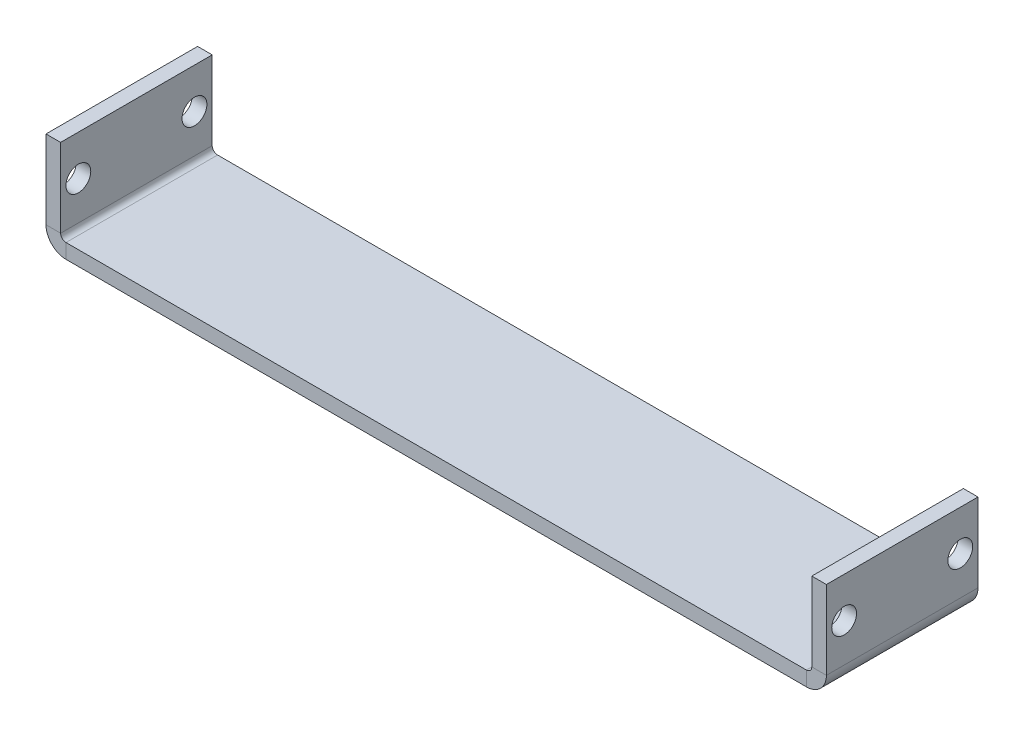
ISO-10303-21;
HEADER;
FILE_DESCRIPTION(('STEP AP214'),'2;1');
FILE_NAME('part.step','',(''),(''),'','','');
FILE_SCHEMA(('AUTOMOTIVE_DESIGN { 1 0 10303 214 1 1 1 1 }'));
ENDSEC;
DATA;
#1=APPLICATION_CONTEXT('core data for automotive mechanical design processes');
#2=APPLICATION_PROTOCOL_DEFINITION('international standard','automotive_design',2000,#1);
#3=PRODUCT_CONTEXT('',#1,'mechanical');
#4=PRODUCT('Part','Part','',(#3));
#5=PRODUCT_RELATED_PRODUCT_CATEGORY('part','',(#4));
#6=PRODUCT_DEFINITION_FORMATION('','',#4);
#7=PRODUCT_DEFINITION_CONTEXT('part definition',#1,'design');
#8=PRODUCT_DEFINITION('design','',#6,#7);
#9=PRODUCT_DEFINITION_SHAPE('','',#8);
#10=(LENGTH_UNIT() NAMED_UNIT(*) SI_UNIT(.MILLI.,.METRE.));
#11=(NAMED_UNIT(*) PLANE_ANGLE_UNIT() SI_UNIT($,.RADIAN.));
#12=(NAMED_UNIT(*) SI_UNIT($,.STERADIAN.) SOLID_ANGLE_UNIT());
#13=UNCERTAINTY_MEASURE_WITH_UNIT(LENGTH_MEASURE(1.E-05),#10,'distance_accuracy_value','');
#14=(GEOMETRIC_REPRESENTATION_CONTEXT(3) GLOBAL_UNCERTAINTY_ASSIGNED_CONTEXT((#13)) GLOBAL_UNIT_ASSIGNED_CONTEXT((#10,
#11,#12)) REPRESENTATION_CONTEXT('',''));
#15=CARTESIAN_POINT('',(0.,0.,0.));
#16=DIRECTION('',(0.,0.,1.));
#17=DIRECTION('',(1.,0.,0.));
#18=AXIS2_PLACEMENT_3D('',#15,#16,#17);
#19=CARTESIAN_POINT('',(0.,-2.,0.));
#20=DIRECTION('',(0.,-1.,0.));
#21=DIRECTION('',(0.,0.,-1.));
#22=AXIS2_PLACEMENT_3D('',#19,#20,#21);
#23=PLANE('',#22);
#24=DIRECTION('',(-1.,0.,0.));
#25=VECTOR('',#24,1.);
#26=CARTESIAN_POINT('',(8.41008153794016,-2.,-15.1442166992398));
#27=LINE('',#26,#25);
#28=CARTESIAN_POINT('',(-5.08991846205982,-2.,-15.1442166992398));
#29=VERTEX_POINT('',#28);
#30=CARTESIAN_POINT('',(-106.48064091206,-2.,-15.1442166992398));
#31=VERTEX_POINT('',#30);
#32=EDGE_CURVE('E57',#29,#31,#27,.T.);
#33=ORIENTED_EDGE('',*,*,#32,.F.);
#34=DIRECTION('',(0.,0.,1.));
#35=VECTOR('',#34,1.);
#36=CARTESIAN_POINT('',(-5.08991846205982,-2.,0.));
#37=LINE('',#36,#35);
#38=CARTESIAN_POINT('',(-5.08991846205983,-2.,5.61456868899448));
#39=VERTEX_POINT('',#38);
#40=EDGE_CURVE('E264',#29,#39,#37,.T.);
#41=ORIENTED_EDGE('',*,*,#40,.T.);
#42=DIRECTION('',(1.,0.,0.));
#43=VECTOR('',#42,1.);
#44=CARTESIAN_POINT('',(8.41008153794016,-2.,5.61456868899448));
#45=LINE('',#44,#43);
#46=CARTESIAN_POINT('',(-106.48064091206,-2.,5.6145686889945));
#47=VERTEX_POINT('',#46);
#48=EDGE_CURVE('E271',#47,#39,#45,.T.);
#49=ORIENTED_EDGE('',*,*,#48,.F.);
#50=DIRECTION('',(0.,0.,1.));
#51=VECTOR('',#50,1.);
#52=CARTESIAN_POINT('',(-106.48064091206,-2.,0.));
#53=LINE('',#52,#51);
#54=EDGE_CURVE('E253',#31,#47,#53,.T.);
#55=ORIENTED_EDGE('',*,*,#54,.F.);
#56=EDGE_LOOP('',(#33,#41,#49,#55));
#57=FACE_BOUND('',#56,.T.);
#58=ADVANCED_FACE('F53',(#57),#23,.T.);
#59=CARTESIAN_POINT('',(8.41008153794016,-2.,5.61456868899448));
#60=DIRECTION('',(0.,0.,1.));
#61=DIRECTION('',(1.,0.,0.));
#62=AXIS2_PLACEMENT_3D('',#59,#60,#61);
#63=PLANE('',#62);
#64=ORIENTED_EDGE('',*,*,#48,.T.);
#65=DIRECTION('',(0.,1.,0.));
#66=VECTOR('',#65,1.);
#67=CARTESIAN_POINT('',(-5.08991846205982,-2.,5.61456868899448));
#68=LINE('',#67,#66);
#69=CARTESIAN_POINT('',(-5.08991846205982,0.,5.61456868899448));
#70=VERTEX_POINT('',#69);
#71=EDGE_CURVE('E12',#39,#70,#68,.T.);
#72=ORIENTED_EDGE('',*,*,#71,.T.);
#73=DIRECTION('',(1.,0.,0.));
#74=VECTOR('',#73,1.);
#75=CARTESIAN_POINT('',(8.41008153794016,0.,5.61456868899448));
#76=LINE('',#75,#74);
#77=CARTESIAN_POINT('',(-106.48064091206,0.,5.6145686889945));
#78=VERTEX_POINT('',#77);
#79=EDGE_CURVE('E248',#78,#70,#76,.T.);
#80=ORIENTED_EDGE('',*,*,#79,.F.);
#81=DIRECTION('',(0.,1.,0.));
#82=VECTOR('',#81,1.);
#83=CARTESIAN_POINT('',(-106.48064091206,-2.,5.6145686889945));
#84=LINE('',#83,#82);
#85=EDGE_CURVE('E256',#47,#78,#84,.T.);
#86=ORIENTED_EDGE('',*,*,#85,.F.);
#87=EDGE_LOOP('',(#64,#72,#80,#86));
#88=FACE_BOUND('',#87,.T.);
#89=ADVANCED_FACE('F55',(#88),#63,.T.);
#90=CARTESIAN_POINT('',(8.41008153794016,-2.,-15.1442166992398));
#91=DIRECTION('',(0.,0.,-1.));
#92=DIRECTION('',(-1.,0.,0.));
#93=AXIS2_PLACEMENT_3D('',#90,#91,#92);
#94=PLANE('',#93);
#95=DIRECTION('',(-1.,0.,0.));
#96=VECTOR('',#95,1.);
#97=CARTESIAN_POINT('',(8.41008153794016,0.,-15.1442166992398));
#98=LINE('',#97,#96);
#99=CARTESIAN_POINT('',(-5.08991846205983,0.,-15.1442166992398));
#100=VERTEX_POINT('',#99);
#101=CARTESIAN_POINT('',(-106.48064091206,0.,-15.1442166992398));
#102=VERTEX_POINT('',#101);
#103=EDGE_CURVE('E76',#100,#102,#98,.T.);
#104=ORIENTED_EDGE('',*,*,#103,.F.);
#105=DIRECTION('',(0.,-1.,0.));
#106=VECTOR('',#105,1.);
#107=CARTESIAN_POINT('',(-5.08991846205983,-2.,-15.1442166992398));
#108=LINE('',#107,#106);
#109=EDGE_CURVE('E267',#100,#29,#108,.T.);
#110=ORIENTED_EDGE('',*,*,#109,.T.);
#111=ORIENTED_EDGE('',*,*,#32,.T.);
#112=DIRECTION('',(0.,-1.,0.));
#113=VECTOR('',#112,1.);
#114=CARTESIAN_POINT('',(-106.48064091206,-2.,-15.1442166992398));
#115=LINE('',#114,#113);
#116=EDGE_CURVE('E261',#102,#31,#115,.T.);
#117=ORIENTED_EDGE('',*,*,#116,.F.);
#118=EDGE_LOOP('',(#104,#110,#111,#117));
#119=FACE_BOUND('',#118,.T.);
#120=ADVANCED_FACE('F289',(#119),#94,.T.);
#121=CARTESIAN_POINT('',(0.,0.,0.));
#122=DIRECTION('',(0.,-1.,0.));
#123=DIRECTION('',(0.,0.,-1.));
#124=AXIS2_PLACEMENT_3D('',#121,#122,#123);
#125=PLANE('',#124);
#126=DIRECTION('',(0.,0.,1.));
#127=VECTOR('',#126,1.);
#128=CARTESIAN_POINT('',(-5.08991846205982,0.,0.));
#129=LINE('',#128,#127);
#130=EDGE_CURVE('E62',#100,#70,#129,.T.);
#131=ORIENTED_EDGE('',*,*,#130,.F.);
#132=ORIENTED_EDGE('',*,*,#103,.T.);
#133=DIRECTION('',(0.,0.,1.));
#134=VECTOR('',#133,1.);
#135=CARTESIAN_POINT('',(-106.48064091206,0.,0.));
#136=LINE('',#135,#134);
#137=EDGE_CURVE('E259',#102,#78,#136,.T.);
#138=ORIENTED_EDGE('',*,*,#137,.T.);
#139=ORIENTED_EDGE('',*,*,#79,.T.);
#140=EDGE_LOOP('',(#131,#132,#138,#139));
#141=FACE_BOUND('',#140,.T.);
#142=ADVANCED_FACE('F275',(#141),#125,.F.);
#143=CARTESIAN_POINT('',(-106.48064091206,0.7366,-15.1442166992398));
#144=DIRECTION('',(0.,0.,-1.));
#145=DIRECTION('',(-1.,0.,0.));
#146=AXIS2_PLACEMENT_3D('',#143,#144,#145);
#147=PLANE('',#146);
#148=DIRECTION('',(-1.,0.,0.));
#149=VECTOR('',#148,1.);
#150=CARTESIAN_POINT('',(-109.21724091206,0.736600000000004,-15.1442166992398));
#151=LINE('',#150,#149);
#152=CARTESIAN_POINT('',(-107.21724091206,0.73659999999999,-15.1442166992398));
#153=VERTEX_POINT('',#152);
#154=CARTESIAN_POINT('',(-109.21724091206,0.736600000000013,-15.1442166992398));
#155=VERTEX_POINT('',#154);
#156=EDGE_CURVE('E205',#153,#155,#151,.T.);
#157=ORIENTED_EDGE('',*,*,#156,.F.);
#158=CARTESIAN_POINT('',(-106.48064091206,0.7366,-15.1442166992398));
#159=DIRECTION('',(0.,0.,-1.));
#160=DIRECTION('',(-1.,0.,0.));
#161=AXIS2_PLACEMENT_3D('',#158,#159,#160);
#162=CIRCLE('',#161,0.7366);
#163=EDGE_CURVE('E202',#153,#102,#162,.F.);
#164=ORIENTED_EDGE('',*,*,#163,.T.);
#165=ORIENTED_EDGE('',*,*,#116,.T.);
#166=CARTESIAN_POINT('',(-106.48064091206,0.7366,-15.1442166992398));
#167=DIRECTION('',(0.,0.,1.));
#168=DIRECTION('',(-1.,0.,0.));
#169=AXIS2_PLACEMENT_3D('',#166,#167,#168);
#170=CIRCLE('',#169,2.7366);
#171=EDGE_CURVE('E241',#155,#31,#170,.T.);
#172=ORIENTED_EDGE('',*,*,#171,.F.);
#173=EDGE_LOOP('',(#157,#164,#165,#172));
#174=FACE_BOUND('',#173,.T.);
#175=ADVANCED_FACE('F343',(#174),#147,.T.);
#176=CARTESIAN_POINT('',(-106.48064091206,0.7366,5.6145686889945));
#177=DIRECTION('',(0.,0.,1.));
#178=DIRECTION('',(1.,0.,0.));
#179=AXIS2_PLACEMENT_3D('',#176,#177,#178);
#180=PLANE('',#179);
#181=CARTESIAN_POINT('',(-106.48064091206,0.7366,5.6145686889945));
#182=DIRECTION('',(0.,0.,-1.));
#183=DIRECTION('',(-1.,0.,0.));
#184=AXIS2_PLACEMENT_3D('',#181,#182,#183);
#185=CIRCLE('',#184,0.7366);
#186=CARTESIAN_POINT('',(-107.21724091206,0.73659999999999,5.6145686889945));
#187=VERTEX_POINT('',#186);
#188=EDGE_CURVE('E245',#78,#187,#185,.T.);
#189=ORIENTED_EDGE('',*,*,#188,.T.);
#190=DIRECTION('',(1.,0.,0.));
#191=VECTOR('',#190,1.);
#192=CARTESIAN_POINT('',(-109.21724091206,0.736600000000004,5.6145686889945));
#193=LINE('',#192,#191);
#194=CARTESIAN_POINT('',(-109.21724091206,0.736600000000004,5.6145686889945));
#195=VERTEX_POINT('',#194);
#196=EDGE_CURVE('E214',#195,#187,#193,.T.);
#197=ORIENTED_EDGE('',*,*,#196,.F.);
#198=CARTESIAN_POINT('',(-106.48064091206,0.7366,5.6145686889945));
#199=DIRECTION('',(0.,0.,-1.));
#200=DIRECTION('',(1.,0.,0.));
#201=AXIS2_PLACEMENT_3D('',#198,#199,#200);
#202=CIRCLE('',#201,2.7366);
#203=EDGE_CURVE('E244',#47,#195,#202,.T.);
#204=ORIENTED_EDGE('',*,*,#203,.F.);
#205=ORIENTED_EDGE('',*,*,#85,.T.);
#206=EDGE_LOOP('',(#189,#197,#204,#205));
#207=FACE_BOUND('',#206,.T.);
#208=ADVANCED_FACE('F339',(#207),#180,.T.);
#209=CARTESIAN_POINT('',(-106.48064091206,0.7366,16.2677295393068));
#210=DIRECTION('',(0.,0.,-1.));
#211=DIRECTION('',(-1.,0.,0.));
#212=AXIS2_PLACEMENT_3D('',#209,#210,#211);
#213=CYLINDRICAL_SURFACE('',#212,2.7366);
#214=ORIENTED_EDGE('',*,*,#54,.T.);
#215=ORIENTED_EDGE('',*,*,#203,.T.);
#216=DIRECTION('',(0.,0.,1.));
#217=VECTOR('',#216,1.);
#218=CARTESIAN_POINT('',(-109.21724091206,0.736600000000004,0.));
#219=LINE('',#218,#217);
#220=EDGE_CURVE('E220',#155,#195,#219,.T.);
#221=ORIENTED_EDGE('',*,*,#220,.F.);
#222=ORIENTED_EDGE('',*,*,#171,.T.);
#223=EDGE_LOOP('',(#214,#215,#221,#222));
#224=FACE_BOUND('',#223,.T.);
#225=ADVANCED_FACE('F351',(#224),#213,.T.);
#226=CARTESIAN_POINT('',(-106.48064091206,0.7366,16.2677295393068));
#227=DIRECTION('',(0.,0.,-1.));
#228=DIRECTION('',(-1.,0.,0.));
#229=AXIS2_PLACEMENT_3D('',#226,#227,#228);
#230=CYLINDRICAL_SURFACE('',#229,0.7366);
#231=ORIENTED_EDGE('',*,*,#137,.F.);
#232=ORIENTED_EDGE('',*,*,#163,.F.);
#233=DIRECTION('',(0.,0.,1.));
#234=VECTOR('',#233,1.);
#235=CARTESIAN_POINT('',(-107.21724091206,0.73659999999999,0.));
#236=LINE('',#235,#234);
#237=EDGE_CURVE('E195',#153,#187,#236,.T.);
#238=ORIENTED_EDGE('',*,*,#237,.T.);
#239=ORIENTED_EDGE('',*,*,#188,.F.);
#240=EDGE_LOOP('',(#231,#232,#238,#239));
#241=FACE_BOUND('',#240,.T.);
#242=ADVANCED_FACE('F355',(#241),#230,.F.);
#243=CARTESIAN_POINT('',(-109.21724091206,11.508755098888,-15.1442166992398));
#244=DIRECTION('',(0.,1.,0.));
#245=DIRECTION('',(0.,0.,1.));
#246=AXIS2_PLACEMENT_3D('',#243,#244,#245);
#247=PLANE('',#246);
#248=DIRECTION('',(0.,0.,1.));
#249=VECTOR('',#248,1.);
#250=CARTESIAN_POINT('',(-107.21724091206,11.508755098888,-15.1442166992398));
#251=LINE('',#250,#249);
#252=CARTESIAN_POINT('',(-107.21724091206,11.508755098888,-15.1442166992398));
#253=VERTEX_POINT('',#252);
#254=CARTESIAN_POINT('',(-107.21724091206,11.508755098888,5.6145686889945));
#255=VERTEX_POINT('',#254);
#256=EDGE_CURVE('E209',#253,#255,#251,.T.);
#257=ORIENTED_EDGE('',*,*,#256,.F.);
#258=DIRECTION('',(1.,0.,0.));
#259=VECTOR('',#258,1.);
#260=CARTESIAN_POINT('',(-109.21724091206,11.508755098888,-15.1442166992398));
#261=LINE('',#260,#259);
#262=CARTESIAN_POINT('',(-109.21724091206,11.508755098888,-15.1442166992398));
#263=VERTEX_POINT('',#262);
#264=EDGE_CURVE('E199',#263,#253,#261,.T.);
#265=ORIENTED_EDGE('',*,*,#264,.F.);
#266=DIRECTION('',(0.,0.,1.));
#267=VECTOR('',#266,1.);
#268=CARTESIAN_POINT('',(-109.21724091206,11.508755098888,-15.1442166992398));
#269=LINE('',#268,#267);
#270=CARTESIAN_POINT('',(-109.21724091206,11.508755098888,5.6145686889945));
#271=VERTEX_POINT('',#270);
#272=EDGE_CURVE('E236',#263,#271,#269,.T.);
#273=ORIENTED_EDGE('',*,*,#272,.T.);
#274=DIRECTION('',(1.,0.,0.));
#275=VECTOR('',#274,1.);
#276=CARTESIAN_POINT('',(-109.21724091206,11.508755098888,5.6145686889945));
#277=LINE('',#276,#275);
#278=EDGE_CURVE('E234',#271,#255,#277,.T.);
#279=ORIENTED_EDGE('',*,*,#278,.T.);
#280=EDGE_LOOP('',(#257,#265,#273,#279));
#281=FACE_BOUND('',#280,.T.);
#282=ADVANCED_FACE('F358',(#281),#247,.T.);
#283=CARTESIAN_POINT('',(-109.21724091206,6.00875509888797,-12.7148240051227));
#284=DIRECTION('',(1.,0.,0.));
#285=DIRECTION('',(0.,0.,1.));
#286=AXIS2_PLACEMENT_3D('',#283,#284,#285);
#287=CYLINDRICAL_SURFACE('',#286,1.7);
#288=CARTESIAN_POINT('',(-109.21724091206,6.00875509888797,-12.7148240051227));
#289=DIRECTION('',(1.,0.,0.));
#290=DIRECTION('',(0.,0.,-1.));
#291=AXIS2_PLACEMENT_3D('',#288,#289,#290);
#292=CIRCLE('',#291,1.7);
#293=CARTESIAN_POINT('',(-109.21724091206,6.00875509888797,-14.4148240051227));
#294=VERTEX_POINT('',#293);
#295=EDGE_CURVE('E222',#294,#294,#292,.T.);
#296=ORIENTED_EDGE('',*,*,#295,.F.);
#297=EDGE_LOOP('',(#296));
#298=FACE_BOUND('',#297,.T.);
#299=CARTESIAN_POINT('',(-107.21724091206,6.00875509888796,-12.7148240051227));
#300=DIRECTION('',(1.,0.,0.));
#301=DIRECTION('',(0.,0.,-1.));
#302=AXIS2_PLACEMENT_3D('',#299,#300,#301);
#303=CIRCLE('',#302,1.7);
#304=CARTESIAN_POINT('',(-107.21724091206,6.00875509888796,-14.4148240051227));
#305=VERTEX_POINT('',#304);
#306=EDGE_CURVE('E231',#305,#305,#303,.T.);
#307=ORIENTED_EDGE('',*,*,#306,.T.);
#308=EDGE_LOOP('',(#307));
#309=FACE_BOUND('',#308,.T.);
#310=ADVANCED_FACE('F382',(#298,#309),#287,.F.);
#311=CARTESIAN_POINT('',(-109.21724091206,6.00875509888797,3.18517599487734));
#312=DIRECTION('',(1.,0.,0.));
#313=DIRECTION('',(0.,0.,1.));
#314=AXIS2_PLACEMENT_3D('',#311,#312,#313);
#315=CYLINDRICAL_SURFACE('',#314,1.7);
#316=CARTESIAN_POINT('',(-109.21724091206,6.00875509888797,3.18517599487734));
#317=DIRECTION('',(1.,0.,0.));
#318=DIRECTION('',(0.,0.,-1.));
#319=AXIS2_PLACEMENT_3D('',#316,#317,#318);
#320=CIRCLE('',#319,1.7);
#321=CARTESIAN_POINT('',(-109.21724091206,6.00875509888797,1.48517599487734));
#322=VERTEX_POINT('',#321);
#323=EDGE_CURVE('E225',#322,#322,#320,.T.);
#324=ORIENTED_EDGE('',*,*,#323,.F.);
#325=EDGE_LOOP('',(#324));
#326=FACE_BOUND('',#325,.T.);
#327=CARTESIAN_POINT('',(-107.21724091206,6.00875509888796,3.18517599487734));
#328=DIRECTION('',(1.,0.,0.));
#329=DIRECTION('',(0.,0.,-1.));
#330=AXIS2_PLACEMENT_3D('',#327,#328,#329);
#331=CIRCLE('',#330,1.7);
#332=CARTESIAN_POINT('',(-107.21724091206,6.00875509888796,1.48517599487734));
#333=VERTEX_POINT('',#332);
#334=EDGE_CURVE('E228',#333,#333,#331,.T.);
#335=ORIENTED_EDGE('',*,*,#334,.T.);
#336=EDGE_LOOP('',(#335));
#337=FACE_BOUND('',#336,.T.);
#338=ADVANCED_FACE('F378',(#326,#337),#315,.F.);
#339=CARTESIAN_POINT('',(-109.21724091206,-108.471885813172,0.));
#340=DIRECTION('',(-1.,0.,0.));
#341=DIRECTION('',(0.,0.,-1.));
#342=AXIS2_PLACEMENT_3D('',#339,#340,#341);
#343=PLANE('',#342);
#344=ORIENTED_EDGE('',*,*,#323,.T.);
#345=EDGE_LOOP('',(#344));
#346=FACE_BOUND('',#345,.T.);
#347=ORIENTED_EDGE('',*,*,#295,.T.);
#348=EDGE_LOOP('',(#347));
#349=FACE_BOUND('',#348,.T.);
#350=DIRECTION('',(0.,1.,0.));
#351=VECTOR('',#350,1.);
#352=CARTESIAN_POINT('',(-109.21724091206,-116.881967351112,-15.1442166992398));
#353=LINE('',#352,#351);
#354=EDGE_CURVE('E203',#155,#263,#353,.T.);
#355=ORIENTED_EDGE('',*,*,#354,.F.);
#356=ORIENTED_EDGE('',*,*,#220,.T.);
#357=DIRECTION('',(0.,-1.,0.));
#358=VECTOR('',#357,1.);
#359=CARTESIAN_POINT('',(-109.21724091206,-116.881967351112,5.61456868899448));
#360=LINE('',#359,#358);
#361=EDGE_CURVE('E217',#271,#195,#360,.T.);
#362=ORIENTED_EDGE('',*,*,#361,.F.);
#363=ORIENTED_EDGE('',*,*,#272,.F.);
#364=EDGE_LOOP('',(#355,#356,#362,#363));
#365=FACE_BOUND('',#364,.T.);
#366=ADVANCED_FACE('F374',(#346,#349,#365),#343,.T.);
#367=CARTESIAN_POINT('',(-109.21724091206,-116.881967351112,5.61456868899448));
#368=DIRECTION('',(0.,0.,1.));
#369=DIRECTION('',(0.,-1.,0.));
#370=AXIS2_PLACEMENT_3D('',#367,#368,#369);
#371=PLANE('',#370);
#372=ORIENTED_EDGE('',*,*,#361,.T.);
#373=ORIENTED_EDGE('',*,*,#196,.T.);
#374=DIRECTION('',(0.,-1.,0.));
#375=VECTOR('',#374,1.);
#376=CARTESIAN_POINT('',(-107.21724091206,-116.881967351112,5.61456868899448));
#377=LINE('',#376,#375);
#378=EDGE_CURVE('E207',#255,#187,#377,.T.);
#379=ORIENTED_EDGE('',*,*,#378,.F.);
#380=ORIENTED_EDGE('',*,*,#278,.F.);
#381=EDGE_LOOP('',(#372,#373,#379,#380));
#382=FACE_BOUND('',#381,.T.);
#383=ADVANCED_FACE('F370',(#382),#371,.T.);
#384=CARTESIAN_POINT('',(-107.21724091206,-108.471885813172,0.));
#385=DIRECTION('',(-1.,0.,0.));
#386=DIRECTION('',(0.,0.,-1.));
#387=AXIS2_PLACEMENT_3D('',#384,#385,#386);
#388=PLANE('',#387);
#389=ORIENTED_EDGE('',*,*,#237,.F.);
#390=DIRECTION('',(0.,1.,0.));
#391=VECTOR('',#390,1.);
#392=CARTESIAN_POINT('',(-107.21724091206,-116.881967351112,-15.1442166992398));
#393=LINE('',#392,#391);
#394=EDGE_CURVE('E212',#153,#253,#393,.T.);
#395=ORIENTED_EDGE('',*,*,#394,.T.);
#396=ORIENTED_EDGE('',*,*,#256,.T.);
#397=ORIENTED_EDGE('',*,*,#378,.T.);
#398=EDGE_LOOP('',(#389,#395,#396,#397));
#399=FACE_BOUND('',#398,.T.);
#400=ORIENTED_EDGE('',*,*,#306,.F.);
#401=EDGE_LOOP('',(#400));
#402=FACE_BOUND('',#401,.T.);
#403=ORIENTED_EDGE('',*,*,#334,.F.);
#404=EDGE_LOOP('',(#403));
#405=FACE_BOUND('',#404,.T.);
#406=ADVANCED_FACE('F366',(#399,#402,#405),#388,.F.);
#407=CARTESIAN_POINT('',(-109.21724091206,-116.881967351112,-15.1442166992398));
#408=DIRECTION('',(0.,0.,-1.));
#409=DIRECTION('',(0.,1.,0.));
#410=AXIS2_PLACEMENT_3D('',#407,#408,#409);
#411=PLANE('',#410);
#412=ORIENTED_EDGE('',*,*,#394,.F.);
#413=ORIENTED_EDGE('',*,*,#156,.T.);
#414=ORIENTED_EDGE('',*,*,#354,.T.);
#415=ORIENTED_EDGE('',*,*,#264,.T.);
#416=EDGE_LOOP('',(#412,#413,#414,#415));
#417=FACE_BOUND('',#416,.T.);
#418=ADVANCED_FACE('F363',(#417),#411,.T.);
#419=CARTESIAN_POINT('',(-5.08991846205983,0.7366,-15.1442166992398));
#420=DIRECTION('',(0.,0.,-1.));
#421=DIRECTION('',(-1.,0.,0.));
#422=AXIS2_PLACEMENT_3D('',#419,#420,#421);
#423=PLANE('',#422);
#424=ORIENTED_EDGE('',*,*,#109,.F.);
#425=CARTESIAN_POINT('',(-5.08991846205983,0.7366,-15.1442166992398));
#426=DIRECTION('',(0.,0.,1.));
#427=DIRECTION('',(1.,0.,0.));
#428=AXIS2_PLACEMENT_3D('',#425,#426,#427);
#429=CIRCLE('',#428,0.7366);
#430=CARTESIAN_POINT('',(-4.35331846205984,0.736600000000009,-15.1442166992398));
#431=VERTEX_POINT('',#430);
#432=EDGE_CURVE('E164',#100,#431,#429,.T.);
#433=ORIENTED_EDGE('',*,*,#432,.T.);
#434=DIRECTION('',(1.,0.,0.));
#435=VECTOR('',#434,1.);
#436=CARTESIAN_POINT('',(-2.35331846205984,0.736600000000016,-15.1442166992398));
#437=LINE('',#436,#435);
#438=CARTESIAN_POINT('',(-2.35331846205984,0.736600000000023,-15.1442166992398));
#439=VERTEX_POINT('',#438);
#440=EDGE_CURVE('E182',#431,#439,#437,.T.);
#441=ORIENTED_EDGE('',*,*,#440,.T.);
#442=CARTESIAN_POINT('',(-5.08991846205983,0.7366,-15.1442166992398));
#443=DIRECTION('',(0.,0.,1.));
#444=DIRECTION('',(-1.,0.,0.));
#445=AXIS2_PLACEMENT_3D('',#442,#443,#444);
#446=CIRCLE('',#445,2.7366);
#447=EDGE_CURVE('E188',#29,#439,#446,.T.);
#448=ORIENTED_EDGE('',*,*,#447,.F.);
#449=EDGE_LOOP('',(#424,#433,#441,#448));
#450=FACE_BOUND('',#449,.T.);
#451=ADVANCED_FACE('F291',(#450),#423,.T.);
#452=CARTESIAN_POINT('',(-5.08991846205982,0.7366,5.61456868899448));
#453=DIRECTION('',(0.,0.,1.));
#454=DIRECTION('',(1.,0.,0.));
#455=AXIS2_PLACEMENT_3D('',#452,#453,#454);
#456=PLANE('',#455);
#457=DIRECTION('',(-1.,0.,0.));
#458=VECTOR('',#457,1.);
#459=CARTESIAN_POINT('',(-2.35331846205983,0.736600000000016,5.61456868899448));
#460=LINE('',#459,#458);
#461=CARTESIAN_POINT('',(-2.35331846205982,0.736600000000009,5.61456868899448));
#462=VERTEX_POINT('',#461);
#463=CARTESIAN_POINT('',(-4.35331846205983,0.736600000000009,5.61456868899448));
#464=VERTEX_POINT('',#463);
#465=EDGE_CURVE('E152',#462,#464,#460,.T.);
#466=ORIENTED_EDGE('',*,*,#465,.T.);
#467=CARTESIAN_POINT('',(-5.08991846205982,0.7366,5.61456868899448));
#468=DIRECTION('',(0.,0.,1.));
#469=DIRECTION('',(1.,0.,0.));
#470=AXIS2_PLACEMENT_3D('',#467,#468,#469);
#471=CIRCLE('',#470,0.7366);
#472=EDGE_CURVE('E192',#464,#70,#471,.F.);
#473=ORIENTED_EDGE('',*,*,#472,.T.);
#474=ORIENTED_EDGE('',*,*,#71,.F.);
#475=CARTESIAN_POINT('',(-5.08991846205982,0.7366,5.61456868899448));
#476=DIRECTION('',(0.,0.,-1.));
#477=DIRECTION('',(1.,0.,0.));
#478=AXIS2_PLACEMENT_3D('',#475,#476,#477);
#479=CIRCLE('',#478,2.7366);
#480=EDGE_CURVE('E191',#462,#39,#479,.T.);
#481=ORIENTED_EDGE('',*,*,#480,.F.);
#482=EDGE_LOOP('',(#466,#473,#474,#481));
#483=FACE_BOUND('',#482,.T.);
#484=ADVANCED_FACE('F281',(#483),#456,.T.);
#485=CARTESIAN_POINT('',(-5.08991846205984,0.7366,-25.7973775495521));
#486=DIRECTION('',(0.,0.,1.));
#487=DIRECTION('',(1.,0.,0.));
#488=AXIS2_PLACEMENT_3D('',#485,#486,#487);
#489=CYLINDRICAL_SURFACE('',#488,2.7366);
#490=ORIENTED_EDGE('',*,*,#480,.T.);
#491=ORIENTED_EDGE('',*,*,#40,.F.);
#492=ORIENTED_EDGE('',*,*,#447,.T.);
#493=DIRECTION('',(0.,0.,1.));
#494=VECTOR('',#493,1.);
#495=CARTESIAN_POINT('',(-2.35331846205983,0.736600000000016,0.));
#496=LINE('',#495,#494);
#497=EDGE_CURVE('E186',#439,#462,#496,.T.);
#498=ORIENTED_EDGE('',*,*,#497,.T.);
#499=EDGE_LOOP('',(#490,#491,#492,#498));
#500=FACE_BOUND('',#499,.T.);
#501=ADVANCED_FACE('F284',(#500),#489,.T.);
#502=CARTESIAN_POINT('',(-5.08991846205984,0.7366,-25.7973775495521));
#503=DIRECTION('',(0.,0.,1.));
#504=DIRECTION('',(1.,0.,0.));
#505=AXIS2_PLACEMENT_3D('',#502,#503,#504);
#506=CYLINDRICAL_SURFACE('',#505,0.7366);
#507=ORIENTED_EDGE('',*,*,#472,.F.);
#508=DIRECTION('',(0.,0.,1.));
#509=VECTOR('',#508,1.);
#510=CARTESIAN_POINT('',(-4.35331846205983,0.736600000000009,0.));
#511=LINE('',#510,#509);
#512=EDGE_CURVE('E295',#431,#464,#511,.T.);
#513=ORIENTED_EDGE('',*,*,#512,.F.);
#514=ORIENTED_EDGE('',*,*,#432,.F.);
#515=ORIENTED_EDGE('',*,*,#130,.T.);
#516=EDGE_LOOP('',(#507,#513,#514,#515));
#517=FACE_BOUND('',#516,.T.);
#518=ADVANCED_FACE('F293',(#517),#506,.F.);
#519=CARTESIAN_POINT('',(-2.35331846205986,6.00875509888798,-12.7148240051227));
#520=DIRECTION('',(-1.,0.,0.));
#521=DIRECTION('',(0.,0.,1.));
#522=AXIS2_PLACEMENT_3D('',#519,#520,#521);
#523=CYLINDRICAL_SURFACE('',#522,1.7);
#524=CARTESIAN_POINT('',(-2.35331846205986,6.00875509888798,-12.7148240051227));
#525=DIRECTION('',(-1.,0.,0.));
#526=DIRECTION('',(0.,0.,1.));
#527=AXIS2_PLACEMENT_3D('',#524,#525,#526);
#528=CIRCLE('',#527,1.7);
#529=CARTESIAN_POINT('',(-2.35331846205986,6.00875509888798,-11.0148240051227));
#530=VERTEX_POINT('',#529);
#531=EDGE_CURVE('E305',#530,#530,#528,.T.);
#532=ORIENTED_EDGE('',*,*,#531,.F.);
#533=EDGE_LOOP('',(#532));
#534=FACE_BOUND('',#533,.T.);
#535=CARTESIAN_POINT('',(-4.35331846205986,6.00875509888798,-12.7148240051227));
#536=DIRECTION('',(-1.,0.,0.));
#537=DIRECTION('',(0.,0.,1.));
#538=AXIS2_PLACEMENT_3D('',#535,#536,#537);
#539=CIRCLE('',#538,1.7);
#540=CARTESIAN_POINT('',(-4.35331846205986,6.00875509888798,-11.0148240051227));
#541=VERTEX_POINT('',#540);
#542=EDGE_CURVE('E176',#541,#541,#539,.T.);
#543=ORIENTED_EDGE('',*,*,#542,.T.);
#544=EDGE_LOOP('',(#543));
#545=FACE_BOUND('',#544,.T.);
#546=ADVANCED_FACE('F314',(#534,#545),#523,.F.);
#547=CARTESIAN_POINT('',(-2.35331846205985,6.00875509888797,3.18517599487734));
#548=DIRECTION('',(-1.,0.,0.));
#549=DIRECTION('',(0.,0.,1.));
#550=AXIS2_PLACEMENT_3D('',#547,#548,#549);
#551=CYLINDRICAL_SURFACE('',#550,1.7);
#552=CARTESIAN_POINT('',(-2.35331846205985,6.00875509888797,3.18517599487734));
#553=DIRECTION('',(-1.,0.,0.));
#554=DIRECTION('',(0.,0.,1.));
#555=AXIS2_PLACEMENT_3D('',#552,#553,#554);
#556=CIRCLE('',#555,1.7);
#557=CARTESIAN_POINT('',(-2.35331846205985,6.00875509888797,4.88517599487734));
#558=VERTEX_POINT('',#557);
#559=EDGE_CURVE('E173',#558,#558,#556,.T.);
#560=ORIENTED_EDGE('',*,*,#559,.F.);
#561=EDGE_LOOP('',(#560));
#562=FACE_BOUND('',#561,.T.);
#563=CARTESIAN_POINT('',(-4.35331846205985,6.00875509888797,3.18517599487734));
#564=DIRECTION('',(-1.,0.,0.));
#565=DIRECTION('',(0.,0.,1.));
#566=AXIS2_PLACEMENT_3D('',#563,#564,#565);
#567=CIRCLE('',#566,1.7);
#568=CARTESIAN_POINT('',(-4.35331846205985,6.00875509888797,4.88517599487735));
#569=VERTEX_POINT('',#568);
#570=EDGE_CURVE('E171',#569,#569,#567,.T.);
#571=ORIENTED_EDGE('',*,*,#570,.T.);
#572=EDGE_LOOP('',(#571));
#573=FACE_BOUND('',#572,.T.);
#574=ADVANCED_FACE('F311',(#562,#573),#551,.F.);
#575=CARTESIAN_POINT('',(-2.35331846205988,11.508755098888,-15.1442166992398));
#576=DIRECTION('',(0.,1.,0.));
#577=DIRECTION('',(0.,0.,-1.));
#578=AXIS2_PLACEMENT_3D('',#575,#576,#577);
#579=PLANE('',#578);
#580=DIRECTION('',(0.,0.,-1.));
#581=VECTOR('',#580,1.);
#582=CARTESIAN_POINT('',(-4.35331846205988,11.508755098888,-15.1442166992398));
#583=LINE('',#582,#581);
#584=CARTESIAN_POINT('',(-4.35331846205987,11.508755098888,5.61456868899449));
#585=VERTEX_POINT('',#584);
#586=CARTESIAN_POINT('',(-4.35331846205988,11.508755098888,-15.1442166992398));
#587=VERTEX_POINT('',#586);
#588=EDGE_CURVE('E156',#585,#587,#583,.T.);
#589=ORIENTED_EDGE('',*,*,#588,.F.);
#590=DIRECTION('',(-1.,0.,0.));
#591=VECTOR('',#590,1.);
#592=CARTESIAN_POINT('',(-2.35331846205986,11.508755098888,5.61456868899449));
#593=LINE('',#592,#591);
#594=CARTESIAN_POINT('',(-2.35331846205986,11.508755098888,5.61456868899449));
#595=VERTEX_POINT('',#594);
#596=EDGE_CURVE('E149',#595,#585,#593,.T.);
#597=ORIENTED_EDGE('',*,*,#596,.F.);
#598=DIRECTION('',(0.,0.,-1.));
#599=VECTOR('',#598,1.);
#600=CARTESIAN_POINT('',(-2.35331846205988,11.508755098888,-15.1442166992398));
#601=LINE('',#600,#599);
#602=CARTESIAN_POINT('',(-2.35331846205988,11.508755098888,-15.1442166992398));
#603=VERTEX_POINT('',#602);
#604=EDGE_CURVE('E161',#595,#603,#601,.T.);
#605=ORIENTED_EDGE('',*,*,#604,.T.);
#606=DIRECTION('',(-1.,0.,0.));
#607=VECTOR('',#606,1.);
#608=CARTESIAN_POINT('',(-2.35331846205988,11.508755098888,-15.1442166992398));
#609=LINE('',#608,#607);
#610=EDGE_CURVE('E170',#603,#587,#609,.T.);
#611=ORIENTED_EDGE('',*,*,#610,.T.);
#612=EDGE_LOOP('',(#589,#597,#605,#611));
#613=FACE_BOUND('',#612,.T.);
#614=ADVANCED_FACE('F160',(#613),#579,.T.);
#615=CARTESIAN_POINT('',(-2.35331846205984,3.09867356094782,0.));
#616=DIRECTION('',(1.,0.,0.));
#617=DIRECTION('',(0.,0.,-1.));
#618=AXIS2_PLACEMENT_3D('',#615,#616,#617);
#619=PLANE('',#618);
#620=ORIENTED_EDGE('',*,*,#497,.F.);
#621=DIRECTION('',(0.,-1.,0.));
#622=VECTOR('',#621,1.);
#623=CARTESIAN_POINT('',(-2.35331846205988,11.508755098888,-15.1442166992398));
#624=LINE('',#623,#622);
#625=EDGE_CURVE('E169',#603,#439,#624,.T.);
#626=ORIENTED_EDGE('',*,*,#625,.F.);
#627=ORIENTED_EDGE('',*,*,#604,.F.);
#628=DIRECTION('',(0.,1.,0.));
#629=VECTOR('',#628,1.);
#630=CARTESIAN_POINT('',(-2.35331846205986,11.508755098888,5.61456868899449));
#631=LINE('',#630,#629);
#632=EDGE_CURVE('E146',#462,#595,#631,.T.);
#633=ORIENTED_EDGE('',*,*,#632,.F.);
#634=EDGE_LOOP('',(#620,#626,#627,#633));
#635=FACE_BOUND('',#634,.T.);
#636=ORIENTED_EDGE('',*,*,#559,.T.);
#637=EDGE_LOOP('',(#636));
#638=FACE_BOUND('',#637,.T.);
#639=ORIENTED_EDGE('',*,*,#531,.T.);
#640=EDGE_LOOP('',(#639));
#641=FACE_BOUND('',#640,.T.);
#642=ADVANCED_FACE('F166',(#635,#638,#641),#619,.T.);
#643=CARTESIAN_POINT('',(-2.35331846205988,11.508755098888,-15.1442166992398));
#644=DIRECTION('',(0.,0.,-1.));
#645=DIRECTION('',(0.,-1.,0.));
#646=AXIS2_PLACEMENT_3D('',#643,#644,#645);
#647=PLANE('',#646);
#648=ORIENTED_EDGE('',*,*,#440,.F.);
#649=DIRECTION('',(0.,-1.,0.));
#650=VECTOR('',#649,1.);
#651=CARTESIAN_POINT('',(-4.35331846205988,11.508755098888,-15.1442166992398));
#652=LINE('',#651,#650);
#653=EDGE_CURVE('E298',#587,#431,#652,.T.);
#654=ORIENTED_EDGE('',*,*,#653,.F.);
#655=ORIENTED_EDGE('',*,*,#610,.F.);
#656=ORIENTED_EDGE('',*,*,#625,.T.);
#657=EDGE_LOOP('',(#648,#654,#655,#656));
#658=FACE_BOUND('',#657,.T.);
#659=ADVANCED_FACE('F320',(#658),#647,.T.);
#660=CARTESIAN_POINT('',(-4.35331846205984,3.09867356094781,0.));
#661=DIRECTION('',(1.,0.,0.));
#662=DIRECTION('',(0.,0.,-1.));
#663=AXIS2_PLACEMENT_3D('',#660,#661,#662);
#664=PLANE('',#663);
#665=ORIENTED_EDGE('',*,*,#542,.F.);
#666=EDGE_LOOP('',(#665));
#667=FACE_BOUND('',#666,.T.);
#668=ORIENTED_EDGE('',*,*,#570,.F.);
#669=EDGE_LOOP('',(#668));
#670=FACE_BOUND('',#669,.T.);
#671=ORIENTED_EDGE('',*,*,#653,.T.);
#672=ORIENTED_EDGE('',*,*,#512,.T.);
#673=DIRECTION('',(0.,1.,0.));
#674=VECTOR('',#673,1.);
#675=CARTESIAN_POINT('',(-4.35331846205987,11.508755098888,5.61456868899449));
#676=LINE('',#675,#674);
#677=EDGE_CURVE('E297',#464,#585,#676,.T.);
#678=ORIENTED_EDGE('',*,*,#677,.T.);
#679=ORIENTED_EDGE('',*,*,#588,.T.);
#680=EDGE_LOOP('',(#671,#672,#678,#679));
#681=FACE_BOUND('',#680,.T.);
#682=ADVANCED_FACE('F318',(#667,#670,#681),#664,.F.);
#683=CARTESIAN_POINT('',(-2.35331846205986,11.508755098888,5.61456868899449));
#684=DIRECTION('',(0.,0.,1.));
#685=DIRECTION('',(0.,1.,0.));
#686=AXIS2_PLACEMENT_3D('',#683,#684,#685);
#687=PLANE('',#686);
#688=ORIENTED_EDGE('',*,*,#465,.F.);
#689=ORIENTED_EDGE('',*,*,#632,.T.);
#690=ORIENTED_EDGE('',*,*,#596,.T.);
#691=ORIENTED_EDGE('',*,*,#677,.F.);
#692=EDGE_LOOP('',(#688,#689,#690,#691));
#693=FACE_BOUND('',#692,.T.);
#694=ADVANCED_FACE('F148',(#693),#687,.T.);
#695=CLOSED_SHELL('',(#58,#89,#120,#142,#175,#208,#225,#242,#282,#310,#338,#366,#383,#406,#418,
#451,#484,#501,#518,#546,#574,#614,#642,#659,#682,#694));
#696=MANIFOLD_SOLID_BREP('B2',#695);
#697=ADVANCED_BREP_SHAPE_REPRESENTATION('',(#18,#696),#14);
#698=SHAPE_DEFINITION_REPRESENTATION(#9,#697);
ENDSEC;
END-ISO-10303-21;
